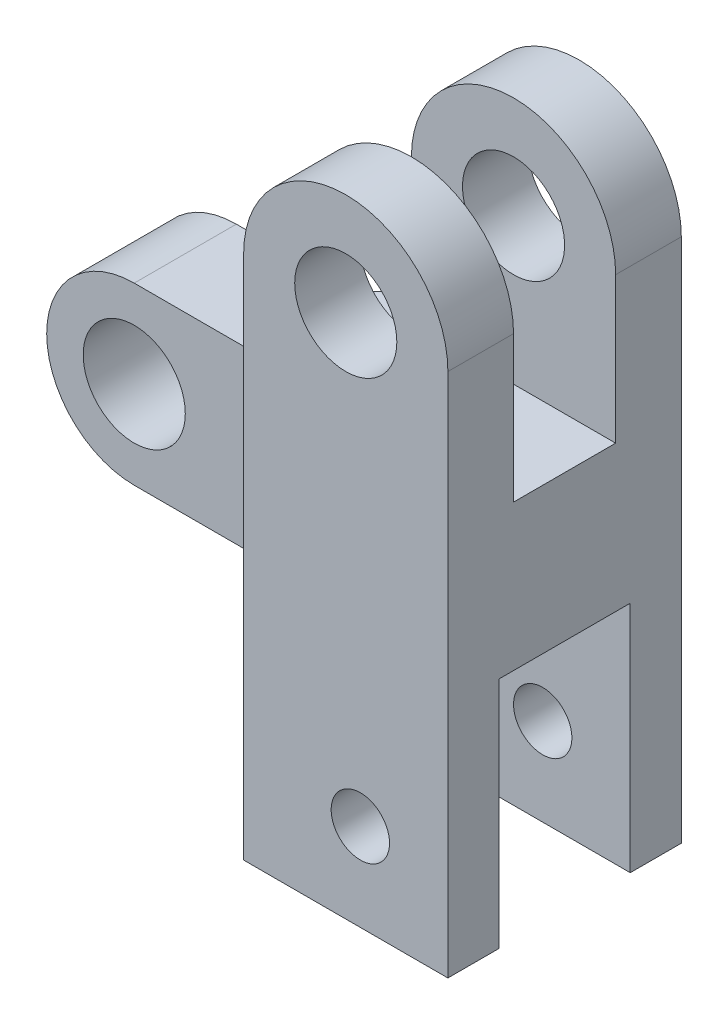
ISO-10303-21;
HEADER;
FILE_DESCRIPTION(('STEP AP214'),'2;1');
FILE_NAME('part.step','',(''),(''),'','','');
FILE_SCHEMA(('AUTOMOTIVE_DESIGN { 1 0 10303 214 1 1 1 1 }'));
ENDSEC;
DATA;
#1=APPLICATION_CONTEXT('core data for automotive mechanical design processes');
#2=APPLICATION_PROTOCOL_DEFINITION('international standard','automotive_design',2000,#1);
#3=PRODUCT_CONTEXT('',#1,'mechanical');
#4=PRODUCT('Part','Part','',(#3));
#5=PRODUCT_RELATED_PRODUCT_CATEGORY('part','',(#4));
#6=PRODUCT_DEFINITION_FORMATION('','',#4);
#7=PRODUCT_DEFINITION_CONTEXT('part definition',#1,'design');
#8=PRODUCT_DEFINITION('design','',#6,#7);
#9=PRODUCT_DEFINITION_SHAPE('','',#8);
#10=(LENGTH_UNIT() NAMED_UNIT(*) SI_UNIT(.MILLI.,.METRE.));
#11=(NAMED_UNIT(*) PLANE_ANGLE_UNIT() SI_UNIT($,.RADIAN.));
#12=(NAMED_UNIT(*) SI_UNIT($,.STERADIAN.) SOLID_ANGLE_UNIT());
#13=UNCERTAINTY_MEASURE_WITH_UNIT(LENGTH_MEASURE(1.E-05),#10,'distance_accuracy_value','');
#14=(GEOMETRIC_REPRESENTATION_CONTEXT(3) GLOBAL_UNCERTAINTY_ASSIGNED_CONTEXT((#13)) GLOBAL_UNIT_ASSIGNED_CONTEXT((#10,
#11,#12)) REPRESENTATION_CONTEXT('',''));
#15=CARTESIAN_POINT('',(0.,0.,0.));
#16=DIRECTION('',(0.,0.,1.));
#17=DIRECTION('',(1.,0.,0.));
#18=AXIS2_PLACEMENT_3D('',#15,#16,#17);
#19=CARTESIAN_POINT('',(0.,-8.,0.));
#20=DIRECTION('',(0.,-1.,0.));
#21=DIRECTION('',(0.,0.,-1.));
#22=AXIS2_PLACEMENT_3D('',#19,#20,#21);
#23=PLANE('',#22);
#24=DIRECTION('',(0.,0.,-1.));
#25=VECTOR('',#24,1.);
#26=CARTESIAN_POINT('',(0.,-8.,3.5));
#27=LINE('',#26,#25);
#28=CARTESIAN_POINT('',(0.,-8.,4.));
#29=VERTEX_POINT('',#28);
#30=CARTESIAN_POINT('',(0.,-8.,2.25));
#31=VERTEX_POINT('',#30);
#32=EDGE_CURVE('E233',#29,#31,#27,.T.);
#33=ORIENTED_EDGE('',*,*,#32,.T.);
#34=DIRECTION('',(1.,0.,0.));
#35=VECTOR('',#34,1.);
#36=CARTESIAN_POINT('',(0.,-8.,2.25));
#37=LINE('',#36,#35);
#38=CARTESIAN_POINT('',(7.,-8.,2.25));
#39=VERTEX_POINT('',#38);
#40=EDGE_CURVE('E294',#31,#39,#37,.T.);
#41=ORIENTED_EDGE('',*,*,#40,.T.);
#42=DIRECTION('',(0.,0.,1.));
#43=VECTOR('',#42,1.);
#44=CARTESIAN_POINT('',(7.,-8.,-3.5));
#45=LINE('',#44,#43);
#46=CARTESIAN_POINT('',(7.,-8.,4.));
#47=VERTEX_POINT('',#46);
#48=EDGE_CURVE('E263',#39,#47,#45,.T.);
#49=ORIENTED_EDGE('',*,*,#48,.T.);
#50=DIRECTION('',(1.,0.,0.));
#51=VECTOR('',#50,1.);
#52=CARTESIAN_POINT('',(0.,-8.,4.));
#53=LINE('',#52,#51);
#54=EDGE_CURVE('E304',#29,#47,#53,.T.);
#55=ORIENTED_EDGE('',*,*,#54,.F.);
#56=EDGE_LOOP('',(#33,#41,#49,#55));
#57=FACE_BOUND('',#56,.T.);
#58=ADVANCED_FACE('F51',(#57),#23,.T.);
#59=DIRECTION('',(-1.,0.,0.));
#60=VECTOR('',#59,1.);
#61=CARTESIAN_POINT('',(0.,-8.,-2.25));
#62=LINE('',#61,#60);
#63=CARTESIAN_POINT('',(7.,-8.,-2.25));
#64=VERTEX_POINT('',#63);
#65=CARTESIAN_POINT('',(0.,-8.,-2.25));
#66=VERTEX_POINT('',#65);
#67=EDGE_CURVE('E291',#64,#66,#62,.T.);
#68=ORIENTED_EDGE('',*,*,#67,.T.);
#69=CARTESIAN_POINT('',(0.,-8.,-4.));
#70=VERTEX_POINT('',#69);
#71=EDGE_CURVE('E259',#66,#70,#27,.T.);
#72=ORIENTED_EDGE('',*,*,#71,.T.);
#73=DIRECTION('',(-1.,0.,0.));
#74=VECTOR('',#73,1.);
#75=CARTESIAN_POINT('',(7.,-8.,-4.));
#76=LINE('',#75,#74);
#77=CARTESIAN_POINT('',(7.,-8.,-4.));
#78=VERTEX_POINT('',#77);
#79=EDGE_CURVE('E315',#78,#70,#76,.T.);
#80=ORIENTED_EDGE('',*,*,#79,.F.);
#81=EDGE_CURVE('E260',#78,#64,#45,.T.);
#82=ORIENTED_EDGE('',*,*,#81,.T.);
#83=EDGE_LOOP('',(#68,#72,#80,#82));
#84=FACE_BOUND('',#83,.T.);
#85=ADVANCED_FACE('F424',(#84),#23,.T.);
#86=CARTESIAN_POINT('',(0.,-2.,2.25));
#87=DIRECTION('',(0.,0.,-1.));
#88=DIRECTION('',(-1.,0.,0.));
#89=AXIS2_PLACEMENT_3D('',#86,#87,#88);
#90=PLANE('',#89);
#91=CARTESIAN_POINT('',(4.,-5.,2.25));
#92=DIRECTION('',(0.,0.,-1.));
#93=DIRECTION('',(-1.,0.,0.));
#94=AXIS2_PLACEMENT_3D('',#91,#92,#93);
#95=CIRCLE('',#94,1.);
#96=CARTESIAN_POINT('',(3.,-5.,2.25));
#97=VERTEX_POINT('',#96);
#98=EDGE_CURVE('E220',#97,#97,#95,.T.);
#99=ORIENTED_EDGE('',*,*,#98,.F.);
#100=EDGE_LOOP('',(#99));
#101=FACE_BOUND('',#100,.T.);
#102=DIRECTION('',(0.,1.,0.));
#103=VECTOR('',#102,1.);
#104=CARTESIAN_POINT('',(0.,-2.,2.25));
#105=LINE('',#104,#103);
#106=CARTESIAN_POINT('',(0.,-0.999999999999999,2.25));
#107=VERTEX_POINT('',#106);
#108=EDGE_CURVE('E345',#31,#107,#105,.T.);
#109=ORIENTED_EDGE('',*,*,#108,.T.);
#110=DIRECTION('',(-1.,0.,0.));
#111=VECTOR('',#110,1.);
#112=CARTESIAN_POINT('',(0.,-0.999999999999999,2.25));
#113=LINE('',#112,#111);
#114=CARTESIAN_POINT('',(-1.,-0.999999999999999,2.25));
#115=VERTEX_POINT('',#114);
#116=EDGE_CURVE('E338',#107,#115,#113,.T.);
#117=ORIENTED_EDGE('',*,*,#116,.T.);
#118=DIRECTION('',(-0.707106781186548,-0.707106781186548,0.));
#119=VECTOR('',#118,1.);
#120=CARTESIAN_POINT('',(-1.,-0.999999999999997,2.25));
#121=LINE('',#120,#119);
#122=CARTESIAN_POINT('',(0.,0.,2.25));
#123=VERTEX_POINT('',#122);
#124=EDGE_CURVE('E60',#123,#115,#121,.T.);
#125=ORIENTED_EDGE('',*,*,#124,.F.);
#126=DIRECTION('',(1.,0.,0.));
#127=VECTOR('',#126,1.);
#128=CARTESIAN_POINT('',(-4.92442890089805,0.,2.25));
#129=LINE('',#128,#127);
#130=CARTESIAN_POINT('',(7.,0.,2.25));
#131=VERTEX_POINT('',#130);
#132=EDGE_CURVE('E332',#123,#131,#129,.T.);
#133=ORIENTED_EDGE('',*,*,#132,.T.);
#134=DIRECTION('',(0.,-1.,0.));
#135=VECTOR('',#134,1.);
#136=CARTESIAN_POINT('',(7.,-2.,2.25));
#137=LINE('',#136,#135);
#138=EDGE_CURVE('E227',#131,#39,#137,.T.);
#139=ORIENTED_EDGE('',*,*,#138,.T.);
#140=ORIENTED_EDGE('',*,*,#40,.F.);
#141=EDGE_LOOP('',(#109,#117,#125,#133,#139,#140));
#142=FACE_BOUND('',#141,.T.);
#143=ADVANCED_FACE('F370',(#101,#142),#90,.T.);
#144=CARTESIAN_POINT('',(0.,-2.,-2.25));
#145=DIRECTION('',(0.,0.,1.));
#146=DIRECTION('',(1.,0.,0.));
#147=AXIS2_PLACEMENT_3D('',#144,#145,#146);
#148=PLANE('',#147);
#149=CARTESIAN_POINT('',(4.,-5.,-2.25));
#150=DIRECTION('',(0.,0.,1.));
#151=DIRECTION('',(1.,0.,0.));
#152=AXIS2_PLACEMENT_3D('',#149,#150,#151);
#153=CIRCLE('',#152,1.);
#154=CARTESIAN_POINT('',(5.,-5.,-2.25));
#155=VERTEX_POINT('',#154);
#156=EDGE_CURVE('E224',#155,#155,#153,.T.);
#157=ORIENTED_EDGE('',*,*,#156,.F.);
#158=EDGE_LOOP('',(#157));
#159=FACE_BOUND('',#158,.T.);
#160=DIRECTION('',(-0.707106781186548,-0.707106781186548,0.));
#161=VECTOR('',#160,1.);
#162=CARTESIAN_POINT('',(-1.,-1.,-2.25));
#163=LINE('',#162,#161);
#164=CARTESIAN_POINT('',(0.,0.,-2.25));
#165=VERTEX_POINT('',#164);
#166=CARTESIAN_POINT('',(-1.,-1.,-2.25));
#167=VERTEX_POINT('',#166);
#168=EDGE_CURVE('E12',#165,#167,#163,.T.);
#169=ORIENTED_EDGE('',*,*,#168,.T.);
#170=DIRECTION('',(1.,0.,0.));
#171=VECTOR('',#170,1.);
#172=CARTESIAN_POINT('',(0.,-1.,-2.25));
#173=LINE('',#172,#171);
#174=CARTESIAN_POINT('',(0.,-1.,-2.25));
#175=VERTEX_POINT('',#174);
#176=EDGE_CURVE('E342',#167,#175,#173,.T.);
#177=ORIENTED_EDGE('',*,*,#176,.T.);
#178=DIRECTION('',(0.,-1.,0.));
#179=VECTOR('',#178,1.);
#180=CARTESIAN_POINT('',(0.,-2.,-2.25));
#181=LINE('',#180,#179);
#182=EDGE_CURVE('E348',#175,#66,#181,.T.);
#183=ORIENTED_EDGE('',*,*,#182,.T.);
#184=ORIENTED_EDGE('',*,*,#67,.F.);
#185=DIRECTION('',(0.,-1.,0.));
#186=VECTOR('',#185,1.);
#187=CARTESIAN_POINT('',(7.,-2.,-2.25));
#188=LINE('',#187,#186);
#189=CARTESIAN_POINT('',(7.,0.,-2.25));
#190=VERTEX_POINT('',#189);
#191=EDGE_CURVE('E288',#190,#64,#188,.T.);
#192=ORIENTED_EDGE('',*,*,#191,.F.);
#193=DIRECTION('',(1.,0.,0.));
#194=VECTOR('',#193,1.);
#195=CARTESIAN_POINT('',(-4.92442890089805,0.,-2.25));
#196=LINE('',#195,#194);
#197=EDGE_CURVE('E330',#165,#190,#196,.T.);
#198=ORIENTED_EDGE('',*,*,#197,.F.);
#199=EDGE_LOOP('',(#169,#177,#183,#184,#192,#198));
#200=FACE_BOUND('',#199,.T.);
#201=ADVANCED_FACE('F428',(#159,#200),#148,.T.);
#202=CARTESIAN_POINT('',(-2.00000000000001,0.,1.75));
#203=DIRECTION('',(0.707106781186544,0.,-0.707106781186551));
#204=DIRECTION('',(0.,1.,0.));
#205=AXIS2_PLACEMENT_3D('',#202,#203,#204);
#206=PLANE('',#205);
#207=DIRECTION('',(-0.707106781186551,0.,-0.707106781186544));
#208=VECTOR('',#207,1.);
#209=CARTESIAN_POINT('',(-0.999999999999995,-1.,2.75000000000001));
#210=LINE('',#209,#208);
#211=CARTESIAN_POINT('',(0.,-0.999999999999999,3.74999999999999));
#212=VERTEX_POINT('',#211);
#213=CARTESIAN_POINT('',(-2.00000000000001,-1.,1.75));
#214=VERTEX_POINT('',#213);
#215=EDGE_CURVE('E201',#212,#214,#210,.T.);
#216=ORIENTED_EDGE('',*,*,#215,.F.);
#217=DIRECTION('',(0.,-1.,0.));
#218=VECTOR('',#217,1.);
#219=CARTESIAN_POINT('',(0.,2.4,3.74999999999999));
#220=LINE('',#219,#218);
#221=CARTESIAN_POINT('',(0.,5.,3.74999999999999));
#222=VERTEX_POINT('',#221);
#223=EDGE_CURVE('E210',#222,#212,#220,.T.);
#224=ORIENTED_EDGE('',*,*,#223,.F.);
#225=DIRECTION('',(0.707106781186551,0.,0.707106781186544));
#226=VECTOR('',#225,1.);
#227=CARTESIAN_POINT('',(-2.00000000000001,5.,1.75));
#228=LINE('',#227,#226);
#229=CARTESIAN_POINT('',(-2.00000000000001,5.,1.75));
#230=VERTEX_POINT('',#229);
#231=EDGE_CURVE('E188',#230,#222,#228,.T.);
#232=ORIENTED_EDGE('',*,*,#231,.F.);
#233=DIRECTION('',(0.,1.,0.));
#234=VECTOR('',#233,1.);
#235=CARTESIAN_POINT('',(-2.00000000000001,0.,1.75));
#236=LINE('',#235,#234);
#237=EDGE_CURVE('E213',#214,#230,#236,.T.);
#238=ORIENTED_EDGE('',*,*,#237,.F.);
#239=EDGE_LOOP('',(#216,#224,#232,#238));
#240=FACE_BOUND('',#239,.T.);
#241=ADVANCED_FACE('F397',(#240),#206,.F.);
#242=CARTESIAN_POINT('',(0.,2.4,-3.75000000000001));
#243=DIRECTION('',(-0.707106781186551,0.,-0.707106781186544));
#244=DIRECTION('',(0.,-1.,0.));
#245=AXIS2_PLACEMENT_3D('',#242,#243,#244);
#246=PLANE('',#245);
#247=DIRECTION('',(0.,1.,0.));
#248=VECTOR('',#247,1.);
#249=CARTESIAN_POINT('',(0.,5.,-3.75000000000001));
#250=LINE('',#249,#248);
#251=CARTESIAN_POINT('',(0.,-0.999999999999999,-3.75000000000001));
#252=VERTEX_POINT('',#251);
#253=CARTESIAN_POINT('',(0.,5.,-3.75000000000001));
#254=VERTEX_POINT('',#253);
#255=EDGE_CURVE('E189',#252,#254,#250,.T.);
#256=ORIENTED_EDGE('',*,*,#255,.F.);
#257=DIRECTION('',(-0.707106781186544,0.,0.707106781186551));
#258=VECTOR('',#257,1.);
#259=CARTESIAN_POINT('',(-2.75000000000001,-1.,-0.999999999999978));
#260=LINE('',#259,#258);
#261=CARTESIAN_POINT('',(-1.99999999999999,-1.,-1.75));
#262=VERTEX_POINT('',#261);
#263=EDGE_CURVE('E67',#262,#252,#260,.F.);
#264=ORIENTED_EDGE('',*,*,#263,.F.);
#265=DIRECTION('',(0.,-1.,0.));
#266=VECTOR('',#265,1.);
#267=CARTESIAN_POINT('',(-1.99999999999999,0.,-1.75));
#268=LINE('',#267,#266);
#269=CARTESIAN_POINT('',(-1.99999999999999,5.,-1.75));
#270=VERTEX_POINT('',#269);
#271=EDGE_CURVE('E179',#270,#262,#268,.T.);
#272=ORIENTED_EDGE('',*,*,#271,.F.);
#273=DIRECTION('',(0.707106781186544,0.,-0.707106781186551));
#274=VECTOR('',#273,1.);
#275=CARTESIAN_POINT('',(0.,5.,-3.75000000000001));
#276=LINE('',#275,#274);
#277=EDGE_CURVE('E198',#254,#270,#276,.F.);
#278=ORIENTED_EDGE('',*,*,#277,.F.);
#279=EDGE_LOOP('',(#256,#264,#272,#278));
#280=FACE_BOUND('',#279,.T.);
#281=ADVANCED_FACE('F54',(#280),#246,.T.);
#282=CARTESIAN_POINT('',(0.,2.4,-3.5));
#283=DIRECTION('',(1.,0.,0.));
#284=DIRECTION('',(0.,0.,-1.));
#285=AXIS2_PLACEMENT_3D('',#282,#283,#284);
#286=PLANE('',#285);
#287=ORIENTED_EDGE('',*,*,#32,.F.);
#288=DIRECTION('',(0.,-1.,0.));
#289=VECTOR('',#288,1.);
#290=CARTESIAN_POINT('',(0.,10.,4.));
#291=LINE('',#290,#289);
#292=CARTESIAN_POINT('',(0.,10.,4.));
#293=VERTEX_POINT('',#292);
#294=EDGE_CURVE('E296',#293,#29,#291,.T.);
#295=ORIENTED_EDGE('',*,*,#294,.F.);
#296=DIRECTION('',(0.,0.,1.));
#297=VECTOR('',#296,1.);
#298=CARTESIAN_POINT('',(0.,10.,1.75));
#299=LINE('',#298,#297);
#300=CARTESIAN_POINT('',(0.,10.,1.75));
#301=VERTEX_POINT('',#300);
#302=EDGE_CURVE('E245',#301,#293,#299,.T.);
#303=ORIENTED_EDGE('',*,*,#302,.F.);
#304=DIRECTION('',(0.,1.,0.));
#305=VECTOR('',#304,1.);
#306=CARTESIAN_POINT('',(0.,0.,1.75));
#307=LINE('',#306,#305);
#308=CARTESIAN_POINT('',(0.,5.,1.75));
#309=VERTEX_POINT('',#308);
#310=EDGE_CURVE('E253',#309,#301,#307,.T.);
#311=ORIENTED_EDGE('',*,*,#310,.F.);
#312=DIRECTION('',(0.,0.,1.));
#313=VECTOR('',#312,1.);
#314=CARTESIAN_POINT('',(0.,5.,-3.5));
#315=LINE('',#314,#313);
#316=EDGE_CURVE('E76',#309,#222,#315,.T.);
#317=ORIENTED_EDGE('',*,*,#316,.T.);
#318=ORIENTED_EDGE('',*,*,#223,.T.);
#319=DIRECTION('',(0.,0.,-1.));
#320=VECTOR('',#319,1.);
#321=CARTESIAN_POINT('',(0.,-0.999999999999999,4.));
#322=LINE('',#321,#320);
#323=EDGE_CURVE('E351',#212,#107,#322,.T.);
#324=ORIENTED_EDGE('',*,*,#323,.T.);
#325=ORIENTED_EDGE('',*,*,#108,.F.);
#326=EDGE_LOOP('',(#287,#295,#303,#311,#317,#318,#324,#325));
#327=FACE_BOUND('',#326,.T.);
#328=ADVANCED_FACE('F361',(#327),#286,.F.);
#329=ORIENTED_EDGE('',*,*,#71,.F.);
#330=ORIENTED_EDGE('',*,*,#182,.F.);
#331=EDGE_CURVE('E352',#175,#252,#322,.T.);
#332=ORIENTED_EDGE('',*,*,#331,.T.);
#333=ORIENTED_EDGE('',*,*,#255,.T.);
#334=DIRECTION('',(0.,0.,1.));
#335=VECTOR('',#334,1.);
#336=CARTESIAN_POINT('',(0.,5.,-3.5));
#337=LINE('',#336,#335);
#338=CARTESIAN_POINT('',(0.,5.,-1.75));
#339=VERTEX_POINT('',#338);
#340=EDGE_CURVE('E207',#254,#339,#337,.T.);
#341=ORIENTED_EDGE('',*,*,#340,.T.);
#342=DIRECTION('',(0.,1.,0.));
#343=VECTOR('',#342,1.);
#344=CARTESIAN_POINT('',(0.,0.,-1.75));
#345=LINE('',#344,#343);
#346=CARTESIAN_POINT('',(0.,10.,-1.75));
#347=VERTEX_POINT('',#346);
#348=EDGE_CURVE('E243',#339,#347,#345,.T.);
#349=ORIENTED_EDGE('',*,*,#348,.T.);
#350=DIRECTION('',(0.,0.,-1.));
#351=VECTOR('',#350,1.);
#352=CARTESIAN_POINT('',(0.,10.,-1.75));
#353=LINE('',#352,#351);
#354=CARTESIAN_POINT('',(0.,10.,-4.));
#355=VERTEX_POINT('',#354);
#356=EDGE_CURVE('E234',#347,#355,#353,.T.);
#357=ORIENTED_EDGE('',*,*,#356,.T.);
#358=DIRECTION('',(0.,1.,0.));
#359=VECTOR('',#358,1.);
#360=CARTESIAN_POINT('',(0.,-8.,-4.));
#361=LINE('',#360,#359);
#362=EDGE_CURVE('E313',#70,#355,#361,.T.);
#363=ORIENTED_EDGE('',*,*,#362,.F.);
#364=EDGE_LOOP('',(#329,#330,#332,#333,#341,#349,#357,#363));
#365=FACE_BOUND('',#364,.T.);
#366=ADVANCED_FACE('F411',(#365),#286,.F.);
#367=CARTESIAN_POINT('',(7.,2.4,-3.5));
#368=DIRECTION('',(-1.,0.,0.));
#369=DIRECTION('',(0.,0.,1.));
#370=AXIS2_PLACEMENT_3D('',#367,#368,#369);
#371=PLANE('',#370);
#372=ORIENTED_EDGE('',*,*,#138,.F.);
#373=DIRECTION('',(0.,0.,1.));
#374=VECTOR('',#373,1.);
#375=CARTESIAN_POINT('',(7.,0.,2.25));
#376=LINE('',#375,#374);
#377=EDGE_CURVE('E333',#190,#131,#376,.T.);
#378=ORIENTED_EDGE('',*,*,#377,.F.);
#379=ORIENTED_EDGE('',*,*,#191,.T.);
#380=ORIENTED_EDGE('',*,*,#81,.F.);
#381=DIRECTION('',(0.,-1.,0.));
#382=VECTOR('',#381,1.);
#383=CARTESIAN_POINT('',(7.,10.,-4.));
#384=LINE('',#383,#382);
#385=CARTESIAN_POINT('',(7.,10.,-4.));
#386=VERTEX_POINT('',#385);
#387=EDGE_CURVE('E318',#386,#78,#384,.T.);
#388=ORIENTED_EDGE('',*,*,#387,.F.);
#389=DIRECTION('',(0.,0.,-1.));
#390=VECTOR('',#389,1.);
#391=CARTESIAN_POINT('',(7.,10.,-1.75));
#392=LINE('',#391,#390);
#393=CARTESIAN_POINT('',(7.,10.,-1.75));
#394=VERTEX_POINT('',#393);
#395=EDGE_CURVE('E101',#394,#386,#392,.T.);
#396=ORIENTED_EDGE('',*,*,#395,.F.);
#397=DIRECTION('',(0.,-1.,0.));
#398=VECTOR('',#397,1.);
#399=CARTESIAN_POINT('',(7.,0.,-1.75));
#400=LINE('',#399,#398);
#401=CARTESIAN_POINT('',(7.,5.,-1.75));
#402=VERTEX_POINT('',#401);
#403=EDGE_CURVE('E237',#394,#402,#400,.T.);
#404=ORIENTED_EDGE('',*,*,#403,.T.);
#405=DIRECTION('',(0.,0.,-1.));
#406=VECTOR('',#405,1.);
#407=CARTESIAN_POINT('',(7.,5.,1.75));
#408=LINE('',#407,#406);
#409=CARTESIAN_POINT('',(7.,5.,1.75));
#410=VERTEX_POINT('',#409);
#411=EDGE_CURVE('E265',#410,#402,#408,.T.);
#412=ORIENTED_EDGE('',*,*,#411,.F.);
#413=DIRECTION('',(0.,-1.,0.));
#414=VECTOR('',#413,1.);
#415=CARTESIAN_POINT('',(7.,0.,1.75));
#416=LINE('',#415,#414);
#417=CARTESIAN_POINT('',(7.,10.,1.75));
#418=VERTEX_POINT('',#417);
#419=EDGE_CURVE('E249',#418,#410,#416,.T.);
#420=ORIENTED_EDGE('',*,*,#419,.F.);
#421=DIRECTION('',(0.,0.,1.));
#422=VECTOR('',#421,1.);
#423=CARTESIAN_POINT('',(7.,10.,1.75));
#424=LINE('',#423,#422);
#425=CARTESIAN_POINT('',(7.,10.,4.));
#426=VERTEX_POINT('',#425);
#427=EDGE_CURVE('E247',#418,#426,#424,.T.);
#428=ORIENTED_EDGE('',*,*,#427,.T.);
#429=DIRECTION('',(0.,1.,0.));
#430=VECTOR('',#429,1.);
#431=CARTESIAN_POINT('',(7.,-8.,4.));
#432=LINE('',#431,#430);
#433=EDGE_CURVE('E301',#47,#426,#432,.T.);
#434=ORIENTED_EDGE('',*,*,#433,.F.);
#435=ORIENTED_EDGE('',*,*,#48,.F.);
#436=EDGE_LOOP('',(#372,#378,#379,#380,#388,#396,#404,#412,#420,#428,#434,#435));
#437=FACE_BOUND('',#436,.T.);
#438=ADVANCED_FACE('F433',(#437),#371,.F.);
#439=CARTESIAN_POINT('',(4.,-5.,-3.5));
#440=DIRECTION('',(0.,0.,1.));
#441=DIRECTION('',(1.,0.,0.));
#442=AXIS2_PLACEMENT_3D('',#439,#440,#441);
#443=CYLINDRICAL_SURFACE('',#442,1.);
#444=ORIENTED_EDGE('',*,*,#98,.T.);
#445=EDGE_LOOP('',(#444));
#446=FACE_BOUND('',#445,.T.);
#447=CARTESIAN_POINT('',(4.,-5.,4.));
#448=DIRECTION('',(0.,0.,1.));
#449=DIRECTION('',(1.,0.,0.));
#450=AXIS2_PLACEMENT_3D('',#447,#448,#449);
#451=CIRCLE('',#450,1.);
#452=CARTESIAN_POINT('',(5.,-5.,4.));
#453=VERTEX_POINT('',#452);
#454=EDGE_CURVE('E307',#453,#453,#451,.T.);
#455=ORIENTED_EDGE('',*,*,#454,.T.);
#456=EDGE_LOOP('',(#455));
#457=FACE_BOUND('',#456,.T.);
#458=ADVANCED_FACE('F477',(#446,#457),#443,.F.);
#459=ORIENTED_EDGE('',*,*,#156,.T.);
#460=EDGE_LOOP('',(#459));
#461=FACE_BOUND('',#460,.T.);
#462=CARTESIAN_POINT('',(4.,-5.,-4.));
#463=DIRECTION('',(0.,0.,-1.));
#464=DIRECTION('',(-1.,0.,0.));
#465=AXIS2_PLACEMENT_3D('',#462,#463,#464);
#466=CIRCLE('',#465,0.999999999999997);
#467=CARTESIAN_POINT('',(3.,-5.,-4.));
#468=VERTEX_POINT('',#467);
#469=EDGE_CURVE('E324',#468,#468,#466,.T.);
#470=ORIENTED_EDGE('',*,*,#469,.T.);
#471=EDGE_LOOP('',(#470));
#472=FACE_BOUND('',#471,.T.);
#473=ADVANCED_FACE('F475',(#461,#472),#443,.F.);
#474=CARTESIAN_POINT('',(3.5,10.,-1.75));
#475=DIRECTION('',(0.,0.,-1.));
#476=DIRECTION('',(-1.,0.,0.));
#477=AXIS2_PLACEMENT_3D('',#474,#475,#476);
#478=CYLINDRICAL_SURFACE('',#477,3.5);
#479=ORIENTED_EDGE('',*,*,#395,.T.);
#480=CARTESIAN_POINT('',(3.5,10.,-4.));
#481=DIRECTION('',(0.,0.,-1.));
#482=DIRECTION('',(-1.,0.,0.));
#483=AXIS2_PLACEMENT_3D('',#480,#481,#482);
#484=CIRCLE('',#483,3.5);
#485=EDGE_CURVE('E321',#355,#386,#484,.T.);
#486=ORIENTED_EDGE('',*,*,#485,.F.);
#487=ORIENTED_EDGE('',*,*,#356,.F.);
#488=CARTESIAN_POINT('',(3.5,10.,-1.75));
#489=DIRECTION('',(0.,0.,-1.));
#490=DIRECTION('',(-1.,0.,0.));
#491=AXIS2_PLACEMENT_3D('',#488,#489,#490);
#492=CIRCLE('',#491,3.5);
#493=EDGE_CURVE('E241',#347,#394,#492,.T.);
#494=ORIENTED_EDGE('',*,*,#493,.T.);
#495=EDGE_LOOP('',(#479,#486,#487,#494));
#496=FACE_BOUND('',#495,.T.);
#497=ADVANCED_FACE('F417',(#496),#478,.T.);
#498=CARTESIAN_POINT('',(0.,0.,-1.75));
#499=DIRECTION('',(0.,0.,-1.));
#500=DIRECTION('',(-1.,0.,0.));
#501=AXIS2_PLACEMENT_3D('',#498,#499,#500);
#502=PLANE('',#501);
#503=CARTESIAN_POINT('',(3.5,10.,-1.75));
#504=DIRECTION('',(0.,0.,-1.));
#505=DIRECTION('',(-1.,0.,0.));
#506=AXIS2_PLACEMENT_3D('',#503,#504,#505);
#507=CIRCLE('',#506,1.75);
#508=CARTESIAN_POINT('',(1.75,10.,-1.75));
#509=VERTEX_POINT('',#508);
#510=EDGE_CURVE('E232',#509,#509,#507,.T.);
#511=ORIENTED_EDGE('',*,*,#510,.T.);
#512=EDGE_LOOP('',(#511));
#513=FACE_BOUND('',#512,.T.);
#514=ORIENTED_EDGE('',*,*,#348,.F.);
#515=DIRECTION('',(1.,0.,0.));
#516=VECTOR('',#515,1.);
#517=CARTESIAN_POINT('',(0.,5.,-1.75));
#518=LINE('',#517,#516);
#519=EDGE_CURVE('E194',#339,#402,#518,.T.);
#520=ORIENTED_EDGE('',*,*,#519,.T.);
#521=ORIENTED_EDGE('',*,*,#403,.F.);
#522=ORIENTED_EDGE('',*,*,#493,.F.);
#523=EDGE_LOOP('',(#514,#520,#521,#522));
#524=FACE_BOUND('',#523,.T.);
#525=ADVANCED_FACE('F415',(#513,#524),#502,.F.);
#526=CARTESIAN_POINT('',(3.5,10.,1.75));
#527=DIRECTION('',(0.,0.,1.));
#528=DIRECTION('',(1.,0.,0.));
#529=AXIS2_PLACEMENT_3D('',#526,#527,#528);
#530=CYLINDRICAL_SURFACE('',#529,3.5);
#531=ORIENTED_EDGE('',*,*,#302,.T.);
#532=CARTESIAN_POINT('',(3.5,10.,4.));
#533=DIRECTION('',(0.,0.,1.));
#534=DIRECTION('',(1.,0.,0.));
#535=AXIS2_PLACEMENT_3D('',#532,#533,#534);
#536=CIRCLE('',#535,3.5);
#537=EDGE_CURVE('E298',#426,#293,#536,.T.);
#538=ORIENTED_EDGE('',*,*,#537,.F.);
#539=ORIENTED_EDGE('',*,*,#427,.F.);
#540=CARTESIAN_POINT('',(3.5,10.,1.75));
#541=DIRECTION('',(0.,0.,-1.));
#542=DIRECTION('',(-1.,0.,0.));
#543=AXIS2_PLACEMENT_3D('',#540,#541,#542);
#544=CIRCLE('',#543,3.5);
#545=EDGE_CURVE('E251',#301,#418,#544,.T.);
#546=ORIENTED_EDGE('',*,*,#545,.F.);
#547=EDGE_LOOP('',(#531,#538,#539,#546));
#548=FACE_BOUND('',#547,.T.);
#549=ADVANCED_FACE('F388',(#548),#530,.T.);
#550=CARTESIAN_POINT('',(0.,0.,1.75));
#551=DIRECTION('',(0.,0.,-1.));
#552=DIRECTION('',(-1.,0.,0.));
#553=AXIS2_PLACEMENT_3D('',#550,#551,#552);
#554=PLANE('',#553);
#555=DIRECTION('',(1.,0.,0.));
#556=VECTOR('',#555,1.);
#557=CARTESIAN_POINT('',(0.,5.,1.75));
#558=LINE('',#557,#556);
#559=EDGE_CURVE('E219',#309,#410,#558,.T.);
#560=ORIENTED_EDGE('',*,*,#559,.F.);
#561=ORIENTED_EDGE('',*,*,#310,.T.);
#562=ORIENTED_EDGE('',*,*,#545,.T.);
#563=ORIENTED_EDGE('',*,*,#419,.T.);
#564=EDGE_LOOP('',(#560,#561,#562,#563));
#565=FACE_BOUND('',#564,.T.);
#566=CARTESIAN_POINT('',(3.5,10.,1.75));
#567=DIRECTION('',(0.,0.,-1.));
#568=DIRECTION('',(-1.,0.,0.));
#569=AXIS2_PLACEMENT_3D('',#566,#567,#568);
#570=CIRCLE('',#569,1.75);
#571=CARTESIAN_POINT('',(1.75,10.,1.75));
#572=VERTEX_POINT('',#571);
#573=EDGE_CURVE('E229',#572,#572,#570,.T.);
#574=ORIENTED_EDGE('',*,*,#573,.F.);
#575=EDGE_LOOP('',(#574));
#576=FACE_BOUND('',#575,.T.);
#577=ADVANCED_FACE('F393',(#565,#576),#554,.T.);
#578=CARTESIAN_POINT('',(3.5,10.,3.5));
#579=DIRECTION('',(0.,0.,-1.));
#580=DIRECTION('',(-1.,0.,0.));
#581=AXIS2_PLACEMENT_3D('',#578,#579,#580);
#582=CYLINDRICAL_SURFACE('',#581,1.75);
#583=ORIENTED_EDGE('',*,*,#573,.T.);
#584=EDGE_LOOP('',(#583));
#585=FACE_BOUND('',#584,.T.);
#586=CARTESIAN_POINT('',(3.5,10.,4.));
#587=DIRECTION('',(0.,0.,1.));
#588=DIRECTION('',(1.,0.,0.));
#589=AXIS2_PLACEMENT_3D('',#586,#587,#588);
#590=CIRCLE('',#589,1.75);
#591=CARTESIAN_POINT('',(5.25,10.,4.));
#592=VERTEX_POINT('',#591);
#593=EDGE_CURVE('E310',#592,#592,#590,.T.);
#594=ORIENTED_EDGE('',*,*,#593,.T.);
#595=EDGE_LOOP('',(#594));
#596=FACE_BOUND('',#595,.T.);
#597=ADVANCED_FACE('F461',(#585,#596),#582,.F.);
#598=ORIENTED_EDGE('',*,*,#510,.F.);
#599=EDGE_LOOP('',(#598));
#600=FACE_BOUND('',#599,.T.);
#601=CARTESIAN_POINT('',(3.5,10.,-4.));
#602=DIRECTION('',(0.,0.,-1.));
#603=DIRECTION('',(-1.,0.,0.));
#604=AXIS2_PLACEMENT_3D('',#601,#602,#603);
#605=CIRCLE('',#604,1.75);
#606=CARTESIAN_POINT('',(1.75,10.,-4.));
#607=VERTEX_POINT('',#606);
#608=EDGE_CURVE('E327',#607,#607,#605,.T.);
#609=ORIENTED_EDGE('',*,*,#608,.T.);
#610=EDGE_LOOP('',(#609));
#611=FACE_BOUND('',#610,.T.);
#612=ADVANCED_FACE('F464',(#600,#611),#582,.F.);
#613=CARTESIAN_POINT('',(0.,-1.,1.75));
#614=DIRECTION('',(0.,1.,0.));
#615=DIRECTION('',(-1.,0.,0.));
#616=AXIS2_PLACEMENT_3D('',#613,#614,#615);
#617=PLANE('',#616);
#618=DIRECTION('',(1.,0.,0.));
#619=VECTOR('',#618,1.);
#620=CARTESIAN_POINT('',(0.,-1.,-1.75));
#621=LINE('',#620,#619);
#622=CARTESIAN_POINT('',(-6.,-1.,-1.75));
#623=VERTEX_POINT('',#622);
#624=EDGE_CURVE('E182',#623,#262,#621,.T.);
#625=ORIENTED_EDGE('',*,*,#624,.T.);
#626=ORIENTED_EDGE('',*,*,#263,.T.);
#627=ORIENTED_EDGE('',*,*,#331,.F.);
#628=ORIENTED_EDGE('',*,*,#176,.F.);
#629=DIRECTION('',(0.,0.,1.));
#630=VECTOR('',#629,1.);
#631=CARTESIAN_POINT('',(-1.,-1.,1.75));
#632=LINE('',#631,#630);
#633=EDGE_CURVE('E216',#167,#115,#632,.T.);
#634=ORIENTED_EDGE('',*,*,#633,.T.);
#635=ORIENTED_EDGE('',*,*,#116,.F.);
#636=ORIENTED_EDGE('',*,*,#323,.F.);
#637=ORIENTED_EDGE('',*,*,#215,.T.);
#638=DIRECTION('',(1.,0.,0.));
#639=VECTOR('',#638,1.);
#640=CARTESIAN_POINT('',(0.,-1.,1.75));
#641=LINE('',#640,#639);
#642=CARTESIAN_POINT('',(-6.,-1.,1.75));
#643=VERTEX_POINT('',#642);
#644=EDGE_CURVE('E278',#643,#214,#641,.T.);
#645=ORIENTED_EDGE('',*,*,#644,.F.);
#646=DIRECTION('',(0.,0.,-1.));
#647=VECTOR('',#646,1.);
#648=CARTESIAN_POINT('',(-6.,-1.,1.75));
#649=LINE('',#648,#647);
#650=EDGE_CURVE('E193',#643,#623,#649,.T.);
#651=ORIENTED_EDGE('',*,*,#650,.T.);
#652=EDGE_LOOP('',(#625,#626,#627,#628,#634,#635,#636,#637,#645,#651));
#653=FACE_BOUND('',#652,.T.);
#654=ADVANCED_FACE('F191',(#653),#617,.F.);
#655=CARTESIAN_POINT('',(0.,0.,1.75));
#656=DIRECTION('',(0.,0.,1.));
#657=DIRECTION('',(1.,0.,0.));
#658=AXIS2_PLACEMENT_3D('',#655,#656,#657);
#659=PLANE('',#658);
#660=CARTESIAN_POINT('',(-6.,2.,1.75));
#661=DIRECTION('',(0.,0.,1.));
#662=DIRECTION('',(1.,0.,0.));
#663=AXIS2_PLACEMENT_3D('',#660,#661,#662);
#664=CIRCLE('',#663,1.75);
#665=CARTESIAN_POINT('',(-4.25,2.,1.75));
#666=VERTEX_POINT('',#665);
#667=EDGE_CURVE('E271',#666,#666,#664,.T.);
#668=ORIENTED_EDGE('',*,*,#667,.F.);
#669=EDGE_LOOP('',(#668));
#670=FACE_BOUND('',#669,.T.);
#671=ORIENTED_EDGE('',*,*,#644,.T.);
#672=ORIENTED_EDGE('',*,*,#237,.T.);
#673=DIRECTION('',(1.,0.,0.));
#674=VECTOR('',#673,1.);
#675=CARTESIAN_POINT('',(0.,5.,1.75));
#676=LINE('',#675,#674);
#677=CARTESIAN_POINT('',(-6.,5.,1.75));
#678=VERTEX_POINT('',#677);
#679=EDGE_CURVE('E270',#678,#230,#676,.T.);
#680=ORIENTED_EDGE('',*,*,#679,.F.);
#681=CARTESIAN_POINT('',(-6.,2.,1.75));
#682=DIRECTION('',(0.,0.,1.));
#683=DIRECTION('',(1.,0.,0.));
#684=AXIS2_PLACEMENT_3D('',#681,#682,#683);
#685=CIRCLE('',#684,3.);
#686=EDGE_CURVE('E281',#643,#678,#685,.F.);
#687=ORIENTED_EDGE('',*,*,#686,.F.);
#688=EDGE_LOOP('',(#671,#672,#680,#687));
#689=FACE_BOUND('',#688,.T.);
#690=ADVANCED_FACE('F402',(#670,#689),#659,.T.);
#691=CARTESIAN_POINT('',(0.,0.,-1.75));
#692=DIRECTION('',(0.,0.,1.));
#693=DIRECTION('',(1.,0.,0.));
#694=AXIS2_PLACEMENT_3D('',#691,#692,#693);
#695=PLANE('',#694);
#696=CARTESIAN_POINT('',(-6.,2.,-1.75));
#697=DIRECTION('',(0.,0.,1.));
#698=DIRECTION('',(1.,0.,0.));
#699=AXIS2_PLACEMENT_3D('',#696,#697,#698);
#700=CIRCLE('',#699,1.75);
#701=CARTESIAN_POINT('',(-4.25,2.,-1.75));
#702=VERTEX_POINT('',#701);
#703=EDGE_CURVE('E223',#702,#702,#700,.T.);
#704=ORIENTED_EDGE('',*,*,#703,.T.);
#705=EDGE_LOOP('',(#704));
#706=FACE_BOUND('',#705,.T.);
#707=CARTESIAN_POINT('',(-6.,5.,-1.75));
#708=VERTEX_POINT('',#707);
#709=EDGE_CURVE('E185',#708,#270,#518,.T.);
#710=ORIENTED_EDGE('',*,*,#709,.T.);
#711=ORIENTED_EDGE('',*,*,#271,.T.);
#712=ORIENTED_EDGE('',*,*,#624,.F.);
#713=CARTESIAN_POINT('',(-6.,2.,-1.75));
#714=DIRECTION('',(0.,0.,1.));
#715=DIRECTION('',(1.,0.,0.));
#716=AXIS2_PLACEMENT_3D('',#713,#714,#715);
#717=CIRCLE('',#716,3.);
#718=EDGE_CURVE('E195',#623,#708,#717,.F.);
#719=ORIENTED_EDGE('',*,*,#718,.T.);
#720=EDGE_LOOP('',(#710,#711,#712,#719));
#721=FACE_BOUND('',#720,.T.);
#722=ADVANCED_FACE('F180',(#706,#721),#695,.F.);
#723=CARTESIAN_POINT('',(-6.,2.,1.75));
#724=DIRECTION('',(0.,0.,-1.));
#725=DIRECTION('',(-1.,0.,0.));
#726=AXIS2_PLACEMENT_3D('',#723,#724,#725);
#727=CYLINDRICAL_SURFACE('',#726,3.);
#728=ORIENTED_EDGE('',*,*,#718,.F.);
#729=ORIENTED_EDGE('',*,*,#650,.F.);
#730=ORIENTED_EDGE('',*,*,#686,.T.);
#731=DIRECTION('',(0.,0.,-1.));
#732=VECTOR('',#731,1.);
#733=CARTESIAN_POINT('',(-6.,5.,1.75));
#734=LINE('',#733,#732);
#735=EDGE_CURVE('E268',#678,#708,#734,.T.);
#736=ORIENTED_EDGE('',*,*,#735,.T.);
#737=EDGE_LOOP('',(#728,#729,#730,#736));
#738=FACE_BOUND('',#737,.T.);
#739=ADVANCED_FACE('F405',(#738),#727,.T.);
#740=CARTESIAN_POINT('',(-6.,2.,1.75));
#741=DIRECTION('',(0.,0.,-1.));
#742=DIRECTION('',(-1.,0.,0.));
#743=AXIS2_PLACEMENT_3D('',#740,#741,#742);
#744=CYLINDRICAL_SURFACE('',#743,1.75);
#745=ORIENTED_EDGE('',*,*,#667,.T.);
#746=EDGE_LOOP('',(#745));
#747=FACE_BOUND('',#746,.T.);
#748=ORIENTED_EDGE('',*,*,#703,.F.);
#749=EDGE_LOOP('',(#748));
#750=FACE_BOUND('',#749,.T.);
#751=ADVANCED_FACE('F459',(#747,#750),#744,.F.);
#752=CARTESIAN_POINT('',(0.,5.,1.75));
#753=DIRECTION('',(0.,1.,0.));
#754=DIRECTION('',(0.,0.,1.));
#755=AXIS2_PLACEMENT_3D('',#752,#753,#754);
#756=PLANE('',#755);
#757=ORIENTED_EDGE('',*,*,#709,.F.);
#758=ORIENTED_EDGE('',*,*,#735,.F.);
#759=ORIENTED_EDGE('',*,*,#679,.T.);
#760=ORIENTED_EDGE('',*,*,#231,.T.);
#761=ORIENTED_EDGE('',*,*,#316,.F.);
#762=ORIENTED_EDGE('',*,*,#559,.T.);
#763=ORIENTED_EDGE('',*,*,#411,.T.);
#764=ORIENTED_EDGE('',*,*,#519,.F.);
#765=ORIENTED_EDGE('',*,*,#340,.F.);
#766=ORIENTED_EDGE('',*,*,#277,.T.);
#767=EDGE_LOOP('',(#757,#758,#759,#760,#761,#762,#763,#764,#765,#766));
#768=FACE_BOUND('',#767,.T.);
#769=ADVANCED_FACE('F406',(#768),#756,.T.);
#770=CARTESIAN_POINT('',(3.5,10.,4.));
#771=DIRECTION('',(0.,0.,1.));
#772=DIRECTION('',(1.,0.,0.));
#773=AXIS2_PLACEMENT_3D('',#770,#771,#772);
#774=PLANE('',#773);
#775=ORIENTED_EDGE('',*,*,#454,.F.);
#776=EDGE_LOOP('',(#775));
#777=FACE_BOUND('',#776,.T.);
#778=ORIENTED_EDGE('',*,*,#54,.T.);
#779=ORIENTED_EDGE('',*,*,#433,.T.);
#780=ORIENTED_EDGE('',*,*,#537,.T.);
#781=ORIENTED_EDGE('',*,*,#294,.T.);
#782=EDGE_LOOP('',(#778,#779,#780,#781));
#783=FACE_BOUND('',#782,.T.);
#784=ORIENTED_EDGE('',*,*,#593,.F.);
#785=EDGE_LOOP('',(#784));
#786=FACE_BOUND('',#785,.T.);
#787=ADVANCED_FACE('F383',(#777,#783,#786),#774,.T.);
#788=CARTESIAN_POINT('',(3.5,10.,-4.));
#789=DIRECTION('',(0.,0.,-1.));
#790=DIRECTION('',(-1.,0.,0.));
#791=AXIS2_PLACEMENT_3D('',#788,#789,#790);
#792=PLANE('',#791);
#793=ORIENTED_EDGE('',*,*,#469,.F.);
#794=EDGE_LOOP('',(#793));
#795=FACE_BOUND('',#794,.T.);
#796=ORIENTED_EDGE('',*,*,#485,.T.);
#797=ORIENTED_EDGE('',*,*,#387,.T.);
#798=ORIENTED_EDGE('',*,*,#79,.T.);
#799=ORIENTED_EDGE('',*,*,#362,.T.);
#800=EDGE_LOOP('',(#796,#797,#798,#799));
#801=FACE_BOUND('',#800,.T.);
#802=ORIENTED_EDGE('',*,*,#608,.F.);
#803=EDGE_LOOP('',(#802));
#804=FACE_BOUND('',#803,.T.);
#805=ADVANCED_FACE('F420',(#795,#801,#804),#792,.T.);
#806=CARTESIAN_POINT('',(-4.92442890089805,0.,2.25));
#807=DIRECTION('',(0.,1.,0.));
#808=DIRECTION('',(0.,0.,1.));
#809=AXIS2_PLACEMENT_3D('',#806,#807,#808);
#810=PLANE('',#809);
#811=ORIENTED_EDGE('',*,*,#132,.F.);
#812=DIRECTION('',(0.,0.,-1.));
#813=VECTOR('',#812,1.);
#814=CARTESIAN_POINT('',(0.,0.,2.25));
#815=LINE('',#814,#813);
#816=EDGE_CURVE('E92',#123,#165,#815,.T.);
#817=ORIENTED_EDGE('',*,*,#816,.T.);
#818=ORIENTED_EDGE('',*,*,#197,.T.);
#819=ORIENTED_EDGE('',*,*,#377,.T.);
#820=EDGE_LOOP('',(#811,#817,#818,#819));
#821=FACE_BOUND('',#820,.T.);
#822=ADVANCED_FACE('F435',(#821),#810,.F.);
#823=CARTESIAN_POINT('',(-1.,-1.,1.75));
#824=DIRECTION('',(0.707106781186548,-0.707106781186548,0.));
#825=DIRECTION('',(0.,0.,-1.));
#826=AXIS2_PLACEMENT_3D('',#823,#824,#825);
#827=PLANE('',#826);
#828=ORIENTED_EDGE('',*,*,#633,.F.);
#829=ORIENTED_EDGE('',*,*,#168,.F.);
#830=ORIENTED_EDGE('',*,*,#816,.F.);
#831=ORIENTED_EDGE('',*,*,#124,.T.);
#832=EDGE_LOOP('',(#828,#829,#830,#831));
#833=FACE_BOUND('',#832,.T.);
#834=ADVANCED_FACE('F440',(#833),#827,.T.);
#835=CLOSED_SHELL('',(#58,#85,#143,#201,#241,#281,#328,#366,#438,#458,#473,#497,#525,#549,#577,
#597,#612,#654,#690,#722,#739,#751,#769,#787,#805,#822,#834));
#836=MANIFOLD_SOLID_BREP('B2',#835);
#837=ADVANCED_BREP_SHAPE_REPRESENTATION('',(#18,#836),#14);
#838=SHAPE_DEFINITION_REPRESENTATION(#9,#837);
ENDSEC;
END-ISO-10303-21;
